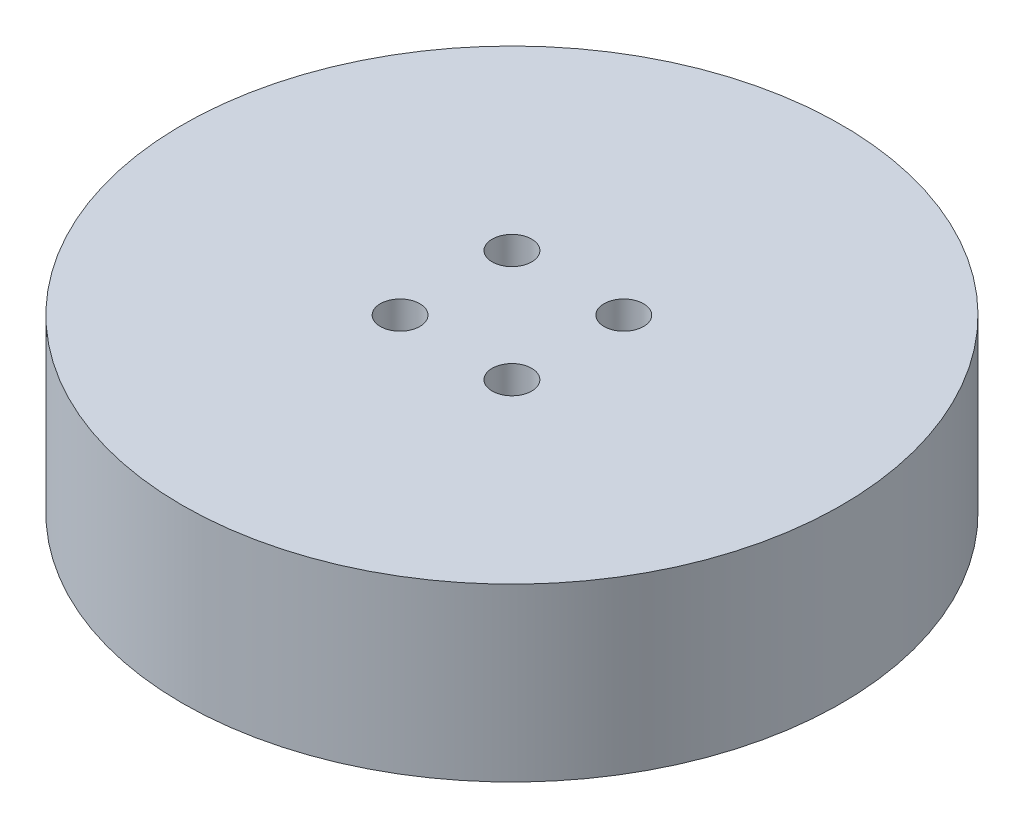
ISO-10303-21;
HEADER;
FILE_DESCRIPTION(('STEP AP214'),'2;1');
FILE_NAME('part.step','',(''),(''),'','','');
FILE_SCHEMA(('AUTOMOTIVE_DESIGN { 1 0 10303 214 1 1 1 1 }'));
ENDSEC;
DATA;
#1=APPLICATION_CONTEXT('core data for automotive mechanical design processes');
#2=APPLICATION_PROTOCOL_DEFINITION('international standard','automotive_design',2000,#1);
#3=PRODUCT_CONTEXT('',#1,'mechanical');
#4=PRODUCT('Part','Part','',(#3));
#5=PRODUCT_RELATED_PRODUCT_CATEGORY('part','',(#4));
#6=PRODUCT_DEFINITION_FORMATION('','',#4);
#7=PRODUCT_DEFINITION_CONTEXT('part definition',#1,'design');
#8=PRODUCT_DEFINITION('design','',#6,#7);
#9=PRODUCT_DEFINITION_SHAPE('','',#8);
#10=(LENGTH_UNIT() NAMED_UNIT(*) SI_UNIT(.MILLI.,.METRE.));
#11=(NAMED_UNIT(*) PLANE_ANGLE_UNIT() SI_UNIT($,.RADIAN.));
#12=(NAMED_UNIT(*) SI_UNIT($,.STERADIAN.) SOLID_ANGLE_UNIT());
#13=UNCERTAINTY_MEASURE_WITH_UNIT(LENGTH_MEASURE(1.E-05),#10,'distance_accuracy_value','');
#14=(GEOMETRIC_REPRESENTATION_CONTEXT(3) GLOBAL_UNCERTAINTY_ASSIGNED_CONTEXT((#13)) GLOBAL_UNIT_ASSIGNED_CONTEXT((#10,
#11,#12)) REPRESENTATION_CONTEXT('',''));
#15=CARTESIAN_POINT('',(0.,0.,0.));
#16=DIRECTION('',(0.,0.,1.));
#17=DIRECTION('',(1.,0.,0.));
#18=AXIS2_PLACEMENT_3D('',#15,#16,#17);
#19=CARTESIAN_POINT('',(0.,0.,-25.));
#20=DIRECTION('',(0.,-1.,0.));
#21=DIRECTION('',(0.,0.,1.));
#22=AXIS2_PLACEMENT_3D('',#19,#20,#21);
#23=PLANE('',#22);
#24=CARTESIAN_POINT('',(0.,0.,0.));
#25=DIRECTION('',(0.,-1.,0.));
#26=DIRECTION('',(0.,0.,-1.));
#27=AXIS2_PLACEMENT_3D('',#24,#25,#26);
#28=CIRCLE('',#27,25.);
#29=CARTESIAN_POINT('',(0.,0.,25.));
#30=VERTEX_POINT('',#29);
#31=EDGE_CURVE('E75',#30,#30,#28,.T.);
#32=ORIENTED_EDGE('',*,*,#31,.T.);
#33=EDGE_LOOP('',(#32));
#34=FACE_BOUND('',#33,.T.);
#35=ADVANCED_FACE('F41',(#34),#23,.T.);
#36=CARTESIAN_POINT('',(0.,13.,0.));
#37=DIRECTION('',(0.,-1.,0.));
#38=DIRECTION('',(0.,0.,1.));
#39=AXIS2_PLACEMENT_3D('',#36,#37,#38);
#40=CYLINDRICAL_SURFACE('',#39,25.);
#41=CARTESIAN_POINT('',(0.,13.,0.));
#42=DIRECTION('',(0.,-1.,0.));
#43=DIRECTION('',(0.,0.,-1.));
#44=AXIS2_PLACEMENT_3D('',#41,#42,#43);
#45=CIRCLE('',#44,25.);
#46=CARTESIAN_POINT('',(0.,13.,25.));
#47=VERTEX_POINT('',#46);
#48=EDGE_CURVE('E77',#47,#47,#45,.T.);
#49=CARTESIAN_POINT('',(0.,13.,25.));
#50=CARTESIAN_POINT('',(0.,12.8645833333333,25.));
#51=CARTESIAN_POINT('',(0.,12.7291666666667,25.));
#52=CARTESIAN_POINT('',(0.,12.4583333333333,25.));
#53=CARTESIAN_POINT('',(0.,12.3229166666667,25.));
#54=CARTESIAN_POINT('',(0.,12.0520833333333,25.));
#55=CARTESIAN_POINT('',(0.,11.9166666666667,25.));
#56=CARTESIAN_POINT('',(0.,11.6458333333333,25.));
#57=CARTESIAN_POINT('',(0.,11.5104166666667,25.));
#58=CARTESIAN_POINT('',(0.,11.2395833333333,25.));
#59=CARTESIAN_POINT('',(0.,11.1041666666667,25.));
#60=CARTESIAN_POINT('',(0.,10.8333333333333,25.));
#61=CARTESIAN_POINT('',(0.,10.6979166666667,25.));
#62=CARTESIAN_POINT('',(0.,10.4270833333333,25.));
#63=CARTESIAN_POINT('',(0.,10.2916666666667,25.));
#64=CARTESIAN_POINT('',(0.,10.0208333333333,25.));
#65=CARTESIAN_POINT('',(0.,9.88541666666667,25.));
#66=CARTESIAN_POINT('',(0.,9.61458333333333,25.));
#67=CARTESIAN_POINT('',(0.,9.47916666666667,25.));
#68=CARTESIAN_POINT('',(0.,9.20833333333333,25.));
#69=CARTESIAN_POINT('',(0.,9.07291666666667,25.));
#70=CARTESIAN_POINT('',(0.,8.80208333333333,25.));
#71=CARTESIAN_POINT('',(0.,8.66666666666667,25.));
#72=CARTESIAN_POINT('',(0.,8.39583333333333,25.));
#73=CARTESIAN_POINT('',(0.,8.26041666666667,25.));
#74=CARTESIAN_POINT('',(0.,7.98958333333333,25.));
#75=CARTESIAN_POINT('',(0.,7.85416666666667,25.));
#76=CARTESIAN_POINT('',(0.,7.58333333333333,25.));
#77=CARTESIAN_POINT('',(0.,7.44791666666667,25.));
#78=CARTESIAN_POINT('',(0.,7.17708333333333,25.));
#79=CARTESIAN_POINT('',(0.,7.04166666666667,25.));
#80=CARTESIAN_POINT('',(0.,6.77083333333333,25.));
#81=CARTESIAN_POINT('',(0.,6.63541666666667,25.));
#82=CARTESIAN_POINT('',(0.,6.36458333333333,25.));
#83=CARTESIAN_POINT('',(0.,6.22916666666667,25.));
#84=CARTESIAN_POINT('',(0.,5.95833333333333,25.));
#85=CARTESIAN_POINT('',(0.,5.82291666666667,25.));
#86=CARTESIAN_POINT('',(0.,5.55208333333333,25.));
#87=CARTESIAN_POINT('',(0.,5.41666666666667,25.));
#88=CARTESIAN_POINT('',(0.,5.14583333333333,25.));
#89=CARTESIAN_POINT('',(0.,5.01041666666667,25.));
#90=CARTESIAN_POINT('',(0.,4.73958333333333,25.));
#91=CARTESIAN_POINT('',(0.,4.60416666666667,25.));
#92=CARTESIAN_POINT('',(0.,4.33333333333333,25.));
#93=CARTESIAN_POINT('',(0.,4.19791666666667,25.));
#94=CARTESIAN_POINT('',(0.,3.92708333333333,25.));
#95=CARTESIAN_POINT('',(0.,3.79166666666667,25.));
#96=CARTESIAN_POINT('',(0.,3.52083333333333,25.));
#97=CARTESIAN_POINT('',(0.,3.38541666666667,25.));
#98=CARTESIAN_POINT('',(0.,3.11458333333333,25.));
#99=CARTESIAN_POINT('',(0.,2.97916666666667,25.));
#100=CARTESIAN_POINT('',(0.,2.70833333333333,25.));
#101=CARTESIAN_POINT('',(0.,2.57291666666667,25.));
#102=CARTESIAN_POINT('',(0.,2.30208333333333,25.));
#103=CARTESIAN_POINT('',(0.,2.16666666666667,25.));
#104=CARTESIAN_POINT('',(0.,1.89583333333333,25.));
#105=CARTESIAN_POINT('',(0.,1.76041666666667,25.));
#106=CARTESIAN_POINT('',(0.,1.48958333333333,25.));
#107=CARTESIAN_POINT('',(0.,1.35416666666667,25.));
#108=CARTESIAN_POINT('',(0.,1.08333333333333,25.));
#109=CARTESIAN_POINT('',(0.,0.947916666666667,25.));
#110=CARTESIAN_POINT('',(0.,0.677083333333334,25.));
#111=CARTESIAN_POINT('',(0.,0.541666666666667,25.));
#112=CARTESIAN_POINT('',(0.,0.270833333333334,25.));
#113=CARTESIAN_POINT('',(0.,0.135416666666667,25.));
#114=CARTESIAN_POINT('',(0.,0.,25.));
#115=B_SPLINE_CURVE_WITH_KNOTS('',3,(#49,#50,#51,#52,#53,#54,#55,#56,#57,#58,#59,#60,#61,#62,
#63,#64,#65,#66,#67,#68,#69,#70,#71,#72,#73,#74,#75,#76,#77,#78,#79,#80,#81,#82,#83,#84,#85,#86,
#87,#88,#89,#90,#91,#92,#93,#94,#95,#96,#97,#98,#99,#100,#101,#102,#103,#104,#105,#106,#107,
#108,#109,#110,#111,#112,#113,#114),.UNSPECIFIED.,.F.,.F.,(4,2,2,2,2,2,2,2,2,2,2,2,2,2,2,2,2,2,
2,2,2,2,2,2,2,2,2,2,2,2,2,2,4),(0.,0.406249999999999,0.812499999999999,1.21875,1.625,2.03125,
2.4375,2.84375,3.25,3.65625,4.0625,4.46875,4.875,5.28125,5.6875,6.09375,6.5,6.90625,7.3125,
7.71875,8.125,8.53125,8.9375,9.34375,9.75,10.15625,10.5625,10.96875,11.375,11.78125,12.1875,
12.59375,13.),.UNSPECIFIED.);
#116=EDGE_CURVE('BSEAM84',#47,#30,#115,.T.);
#117=ORIENTED_EDGE('',*,*,#48,.T.);
#118=ORIENTED_EDGE('',*,*,#31,.F.);
#119=ORIENTED_EDGE('',*,*,#116,.T.);
#120=ORIENTED_EDGE('',*,*,#116,.F.);
#121=EDGE_LOOP('',(#117,#119,#118,#120));
#122=FACE_BOUND('',#121,.T.);
#123=ADVANCED_FACE('F84',(#122),#40,.T.);
#124=CARTESIAN_POINT('',(0.,13.,0.));
#125=DIRECTION('',(0.,1.,0.));
#126=DIRECTION('',(0.,0.,-1.));
#127=AXIS2_PLACEMENT_3D('',#124,#125,#126);
#128=PLANE('',#127);
#129=CARTESIAN_POINT('',(-4.24264068711929,13.,-4.24264068711928));
#130=DIRECTION('',(0.,-1.,0.));
#131=DIRECTION('',(0.,0.,-1.));
#132=AXIS2_PLACEMENT_3D('',#129,#130,#131);
#133=CIRCLE('',#132,1.5);
#134=CARTESIAN_POINT('',(-4.24264068711929,13.,-5.74264068711928));
#135=VERTEX_POINT('',#134);
#136=EDGE_CURVE('E48',#135,#135,#133,.T.);
#137=ORIENTED_EDGE('',*,*,#136,.T.);
#138=EDGE_LOOP('',(#137));
#139=FACE_BOUND('',#138,.T.);
#140=CARTESIAN_POINT('',(4.24264068711929,13.,-4.24264068711928));
#141=DIRECTION('',(0.,-1.,0.));
#142=DIRECTION('',(0.,0.,-1.));
#143=AXIS2_PLACEMENT_3D('',#140,#141,#142);
#144=CIRCLE('',#143,1.5);
#145=CARTESIAN_POINT('',(4.24264068711929,13.,-5.74264068711928));
#146=VERTEX_POINT('',#145);
#147=EDGE_CURVE('E61',#146,#146,#144,.T.);
#148=ORIENTED_EDGE('',*,*,#147,.T.);
#149=EDGE_LOOP('',(#148));
#150=FACE_BOUND('',#149,.T.);
#151=CARTESIAN_POINT('',(4.24264068711929,13.,4.24264068711929));
#152=DIRECTION('',(0.,-1.,0.));
#153=DIRECTION('',(0.,0.,-1.));
#154=AXIS2_PLACEMENT_3D('',#151,#152,#153);
#155=CIRCLE('',#154,1.5);
#156=CARTESIAN_POINT('',(4.24264068711929,13.,2.74264068711929));
#157=VERTEX_POINT('',#156);
#158=EDGE_CURVE('E44',#157,#157,#155,.T.);
#159=ORIENTED_EDGE('',*,*,#158,.T.);
#160=EDGE_LOOP('',(#159));
#161=FACE_BOUND('',#160,.T.);
#162=CARTESIAN_POINT('',(-4.24264068711929,13.,4.24264068711929));
#163=DIRECTION('',(0.,-1.,0.));
#164=DIRECTION('',(0.,0.,-1.));
#165=AXIS2_PLACEMENT_3D('',#162,#163,#164);
#166=CIRCLE('',#165,1.5);
#167=CARTESIAN_POINT('',(-4.24264068711929,13.,2.74264068711929));
#168=VERTEX_POINT('',#167);
#169=EDGE_CURVE('E68',#168,#168,#166,.T.);
#170=ORIENTED_EDGE('',*,*,#169,.T.);
#171=EDGE_LOOP('',(#170));
#172=FACE_BOUND('',#171,.T.);
#173=ORIENTED_EDGE('',*,*,#48,.F.);
#174=EDGE_LOOP('',(#173));
#175=FACE_BOUND('',#174,.T.);
#176=ADVANCED_FACE('F86',(#139,#150,#161,#172,#175),#128,.T.);
#177=CARTESIAN_POINT('',(-4.24264068711929,3.,4.24264068711929));
#178=DIRECTION('',(0.,1.,0.));
#179=DIRECTION('',(0.,0.,-1.));
#180=AXIS2_PLACEMENT_3D('',#177,#178,#179);
#181=CYLINDRICAL_SURFACE('',#180,1.5);
#182=CARTESIAN_POINT('',(-4.24264068711929,3.,4.24264068711929));
#183=DIRECTION('',(0.,-1.,0.));
#184=DIRECTION('',(0.,0.,-1.));
#185=AXIS2_PLACEMENT_3D('',#182,#183,#184);
#186=CIRCLE('',#185,1.5);
#187=CARTESIAN_POINT('',(-4.24264068711929,3.,2.74264068711929));
#188=VERTEX_POINT('',#187);
#189=EDGE_CURVE('E56',#188,#188,#186,.T.);
#190=ORIENTED_EDGE('',*,*,#189,.T.);
#191=EDGE_LOOP('',(#190));
#192=FACE_BOUND('',#191,.T.);
#193=ORIENTED_EDGE('',*,*,#169,.F.);
#194=EDGE_LOOP('',(#193));
#195=FACE_BOUND('',#194,.T.);
#196=ADVANCED_FACE('F93',(#192,#195),#181,.F.);
#197=CARTESIAN_POINT('',(-4.24264068711929,3.,4.24264068711929));
#198=DIRECTION('',(0.,1.,0.));
#199=DIRECTION('',(0.,0.,-1.));
#200=AXIS2_PLACEMENT_3D('',#197,#198,#199);
#201=PLANE('',#200);
#202=ORIENTED_EDGE('',*,*,#189,.F.);
#203=EDGE_LOOP('',(#202));
#204=FACE_BOUND('',#203,.T.);
#205=ADVANCED_FACE('F99',(#204),#201,.T.);
#206=CARTESIAN_POINT('',(4.24264068711929,3.,4.24264068711929));
#207=DIRECTION('',(0.,1.,0.));
#208=DIRECTION('',(0.,0.,-1.));
#209=AXIS2_PLACEMENT_3D('',#206,#207,#208);
#210=CYLINDRICAL_SURFACE('',#209,1.5);
#211=CARTESIAN_POINT('',(4.24264068711929,3.,4.24264068711929));
#212=DIRECTION('',(0.,-1.,0.));
#213=DIRECTION('',(0.,0.,-1.));
#214=AXIS2_PLACEMENT_3D('',#211,#212,#213);
#215=CIRCLE('',#214,1.5);
#216=CARTESIAN_POINT('',(4.24264068711929,3.,2.74264068711929));
#217=VERTEX_POINT('',#216);
#218=EDGE_CURVE('E63',#217,#217,#215,.T.);
#219=ORIENTED_EDGE('',*,*,#218,.T.);
#220=EDGE_LOOP('',(#219));
#221=FACE_BOUND('',#220,.T.);
#222=ORIENTED_EDGE('',*,*,#158,.F.);
#223=EDGE_LOOP('',(#222));
#224=FACE_BOUND('',#223,.T.);
#225=ADVANCED_FACE('F103',(#221,#224),#210,.F.);
#226=CARTESIAN_POINT('',(4.24264068711929,3.,4.24264068711929));
#227=DIRECTION('',(0.,1.,0.));
#228=DIRECTION('',(0.,0.,-1.));
#229=AXIS2_PLACEMENT_3D('',#226,#227,#228);
#230=PLANE('',#229);
#231=ORIENTED_EDGE('',*,*,#218,.F.);
#232=EDGE_LOOP('',(#231));
#233=FACE_BOUND('',#232,.T.);
#234=ADVANCED_FACE('F119',(#233),#230,.T.);
#235=CARTESIAN_POINT('',(4.24264068711929,3.,-4.24264068711928));
#236=DIRECTION('',(0.,1.,0.));
#237=DIRECTION('',(0.,0.,-1.));
#238=AXIS2_PLACEMENT_3D('',#235,#236,#237);
#239=CYLINDRICAL_SURFACE('',#238,1.5);
#240=CARTESIAN_POINT('',(4.24264068711929,3.,-4.24264068711928));
#241=DIRECTION('',(0.,-1.,0.));
#242=DIRECTION('',(0.,0.,-1.));
#243=AXIS2_PLACEMENT_3D('',#240,#241,#242);
#244=CIRCLE('',#243,1.5);
#245=CARTESIAN_POINT('',(4.24264068711929,3.,-5.74264068711928));
#246=VERTEX_POINT('',#245);
#247=EDGE_CURVE('E53',#246,#246,#244,.T.);
#248=ORIENTED_EDGE('',*,*,#247,.T.);
#249=EDGE_LOOP('',(#248));
#250=FACE_BOUND('',#249,.T.);
#251=ORIENTED_EDGE('',*,*,#147,.F.);
#252=EDGE_LOOP('',(#251));
#253=FACE_BOUND('',#252,.T.);
#254=ADVANCED_FACE('F115',(#250,#253),#239,.F.);
#255=CARTESIAN_POINT('',(4.24264068711929,3.,-4.24264068711928));
#256=DIRECTION('',(0.,1.,0.));
#257=DIRECTION('',(0.,0.,-1.));
#258=AXIS2_PLACEMENT_3D('',#255,#256,#257);
#259=PLANE('',#258);
#260=ORIENTED_EDGE('',*,*,#247,.F.);
#261=EDGE_LOOP('',(#260));
#262=FACE_BOUND('',#261,.T.);
#263=ADVANCED_FACE('F112',(#262),#259,.T.);
#264=CARTESIAN_POINT('',(-4.24264068711929,3.,-4.24264068711928));
#265=DIRECTION('',(0.,1.,0.));
#266=DIRECTION('',(0.,0.,-1.));
#267=AXIS2_PLACEMENT_3D('',#264,#265,#266);
#268=CYLINDRICAL_SURFACE('',#267,1.5);
#269=CARTESIAN_POINT('',(-4.24264068711929,3.,-4.24264068711928));
#270=DIRECTION('',(0.,-1.,0.));
#271=DIRECTION('',(0.,0.,-1.));
#272=AXIS2_PLACEMENT_3D('',#269,#270,#271);
#273=CIRCLE('',#272,1.5);
#274=CARTESIAN_POINT('',(-4.24264068711929,3.,-5.74264068711928));
#275=VERTEX_POINT('',#274);
#276=EDGE_CURVE('E10',#275,#275,#273,.T.);
#277=ORIENTED_EDGE('',*,*,#276,.T.);
#278=EDGE_LOOP('',(#277));
#279=FACE_BOUND('',#278,.T.);
#280=ORIENTED_EDGE('',*,*,#136,.F.);
#281=EDGE_LOOP('',(#280));
#282=FACE_BOUND('',#281,.T.);
#283=ADVANCED_FACE('F108',(#279,#282),#268,.F.);
#284=CARTESIAN_POINT('',(-4.24264068711929,3.,-4.24264068711928));
#285=DIRECTION('',(0.,1.,0.));
#286=DIRECTION('',(0.,0.,-1.));
#287=AXIS2_PLACEMENT_3D('',#284,#285,#286);
#288=PLANE('',#287);
#289=ORIENTED_EDGE('',*,*,#276,.F.);
#290=EDGE_LOOP('',(#289));
#291=FACE_BOUND('',#290,.T.);
#292=ADVANCED_FACE('F105',(#291),#288,.T.);
#293=CLOSED_SHELL('',(#35,#123,#176,#196,#205,#225,#234,#254,#263,#283,#292));
#294=MANIFOLD_SOLID_BREP('B2',#293);
#295=ADVANCED_BREP_SHAPE_REPRESENTATION('',(#18,#294),#14);
#296=SHAPE_DEFINITION_REPRESENTATION(#9,#295);
ENDSEC;
END-ISO-10303-21;
